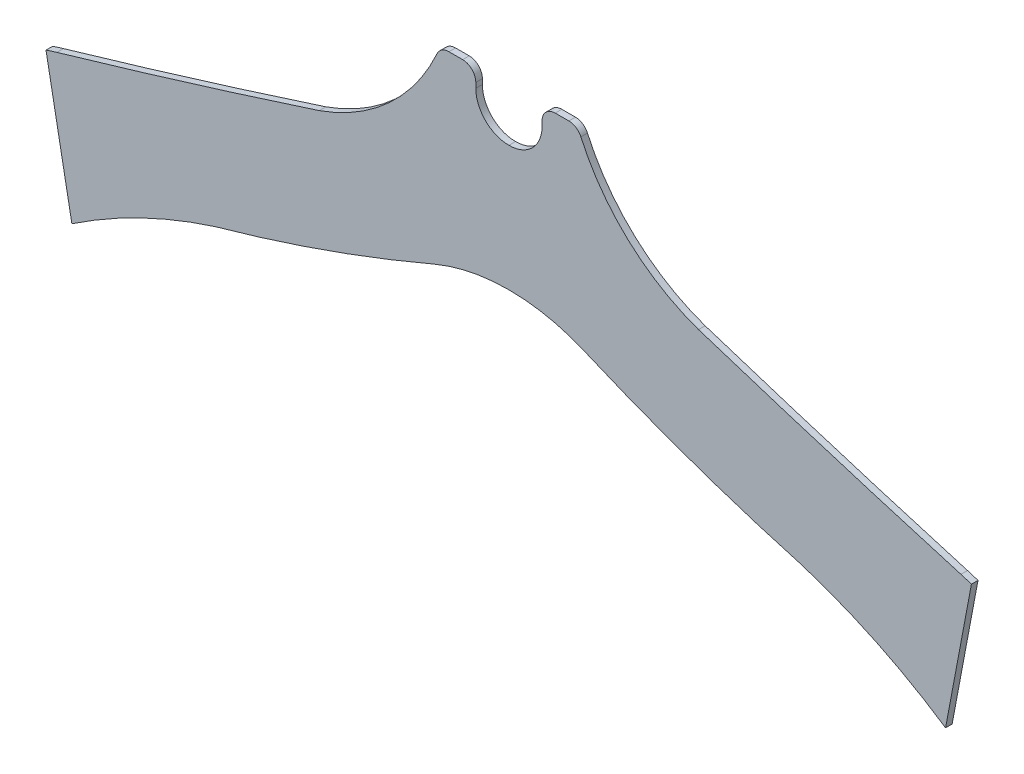
ISO-10303-21;
HEADER;
FILE_DESCRIPTION(('STEP AP214'),'2;1');
FILE_NAME('part.step','',(''),(''),'','','');
FILE_SCHEMA(('AUTOMOTIVE_DESIGN { 1 0 10303 214 1 1 1 1 }'));
ENDSEC;
DATA;
#1=APPLICATION_CONTEXT('core data for automotive mechanical design processes');
#2=APPLICATION_PROTOCOL_DEFINITION('international standard','automotive_design',2000,#1);
#3=PRODUCT_CONTEXT('',#1,'mechanical');
#4=PRODUCT('Part','Part','',(#3));
#5=PRODUCT_RELATED_PRODUCT_CATEGORY('part','',(#4));
#6=PRODUCT_DEFINITION_FORMATION('','',#4);
#7=PRODUCT_DEFINITION_CONTEXT('part definition',#1,'design');
#8=PRODUCT_DEFINITION('design','',#6,#7);
#9=PRODUCT_DEFINITION_SHAPE('','',#8);
#10=(LENGTH_UNIT() NAMED_UNIT(*) SI_UNIT(.MILLI.,.METRE.));
#11=(NAMED_UNIT(*) PLANE_ANGLE_UNIT() SI_UNIT($,.RADIAN.));
#12=(NAMED_UNIT(*) SI_UNIT($,.STERADIAN.) SOLID_ANGLE_UNIT());
#13=UNCERTAINTY_MEASURE_WITH_UNIT(LENGTH_MEASURE(1.E-05),#10,'distance_accuracy_value','');
#14=(GEOMETRIC_REPRESENTATION_CONTEXT(3) GLOBAL_UNCERTAINTY_ASSIGNED_CONTEXT((#13)) GLOBAL_UNIT_ASSIGNED_CONTEXT((#10,
#11,#12)) REPRESENTATION_CONTEXT('',''));
#15=CARTESIAN_POINT('',(0.,0.,0.));
#16=DIRECTION('',(0.,0.,1.));
#17=DIRECTION('',(1.,0.,0.));
#18=AXIS2_PLACEMENT_3D('',#15,#16,#17);
#19=CARTESIAN_POINT('',(-595.807272279208,616.910417452215,0.));
#20=DIRECTION('',(-0.982734564613668,-0.185021013708129,0.));
#21=DIRECTION('',(0.185021013708129,-0.982734564613668,0.));
#22=AXIS2_PLACEMENT_3D('',#19,#20,#21);
#23=PLANE('',#22);
#24=DIRECTION('',(0.185021013708129,-0.982734564613668,0.));
#25=VECTOR('',#24,1.);
#26=CARTESIAN_POINT('',(-168.673710483779,-1651.7989927399,6.35));
#27=LINE('',#26,#25);
#28=CARTESIAN_POINT('',(-446.607072834725,-175.562773039793,6.35));
#29=VERTEX_POINT('',#28);
#30=CARTESIAN_POINT('',(-421.626142062902,-308.248372549149,6.35));
#31=VERTEX_POINT('',#30);
#32=EDGE_CURVE('E42',#29,#31,#27,.T.);
#33=ORIENTED_EDGE('',*,*,#32,.F.);
#34=DIRECTION('',(0.,0.,-1.));
#35=VECTOR('',#34,1.);
#36=CARTESIAN_POINT('',(-446.607072834725,-175.562773039793,6.35));
#37=LINE('',#36,#35);
#38=CARTESIAN_POINT('',(-446.607072834725,-175.562773039793,0.));
#39=VERTEX_POINT('',#38);
#40=EDGE_CURVE('E242',#29,#39,#37,.T.);
#41=ORIENTED_EDGE('',*,*,#40,.T.);
#42=DIRECTION('',(0.185021013708129,-0.982734564613668,0.));
#43=VECTOR('',#42,1.);
#44=CARTESIAN_POINT('',(-168.673710483779,-1651.7989927399,0.));
#45=LINE('',#44,#43);
#46=CARTESIAN_POINT('',(-421.626142062902,-308.248372549149,0.));
#47=VERTEX_POINT('',#46);
#48=EDGE_CURVE('E238',#39,#47,#45,.T.);
#49=ORIENTED_EDGE('',*,*,#48,.T.);
#50=DIRECTION('',(0.,0.,-1.));
#51=VECTOR('',#50,1.);
#52=CARTESIAN_POINT('',(-421.626142062902,-308.248372549149,6.35));
#53=LINE('',#52,#51);
#54=EDGE_CURVE('E217',#31,#47,#53,.T.);
#55=ORIENTED_EDGE('',*,*,#54,.F.);
#56=EDGE_LOOP('',(#33,#41,#49,#55));
#57=FACE_BOUND('',#56,.T.);
#58=ADVANCED_FACE('F38',(#57),#23,.T.);
#59=CARTESIAN_POINT('',(595.807272279208,616.910417452215,0.));
#60=DIRECTION('',(0.982734564613668,-0.185021013708129,0.));
#61=DIRECTION('',(-0.185021013708129,-0.982734564613668,0.));
#62=AXIS2_PLACEMENT_3D('',#59,#60,#61);
#63=PLANE('',#62);
#64=DIRECTION('',(0.185021013708129,0.982734564613668,0.));
#65=VECTOR('',#64,1.);
#66=CARTESIAN_POINT('',(158.629030851378,-1705.15106160708,0.));
#67=LINE('',#66,#65);
#68=CARTESIAN_POINT('',(421.676967883627,-307.978412452182,0.));
#69=VERTEX_POINT('',#68);
#70=CARTESIAN_POINT('',(446.634577743631,-175.416681392487,0.));
#71=VERTEX_POINT('',#70);
#72=EDGE_CURVE('E241',#69,#71,#67,.T.);
#73=ORIENTED_EDGE('',*,*,#72,.T.);
#74=DIRECTION('',(0.,0.,-1.));
#75=VECTOR('',#74,1.);
#76=CARTESIAN_POINT('',(446.634577743631,-175.416681392487,6.35));
#77=LINE('',#76,#75);
#78=CARTESIAN_POINT('',(446.634577743631,-175.416681392487,6.35));
#79=VERTEX_POINT('',#78);
#80=EDGE_CURVE('E240',#71,#79,#77,.F.);
#81=ORIENTED_EDGE('',*,*,#80,.T.);
#82=DIRECTION('',(0.185021013708129,0.982734564613668,0.));
#83=VECTOR('',#82,1.);
#84=CARTESIAN_POINT('',(158.629030851378,-1705.15106160708,6.35));
#85=LINE('',#84,#83);
#86=CARTESIAN_POINT('',(421.676967883627,-307.978412452182,6.35));
#87=VERTEX_POINT('',#86);
#88=EDGE_CURVE('E224',#87,#79,#85,.T.);
#89=ORIENTED_EDGE('',*,*,#88,.F.);
#90=DIRECTION('',(0.,0.,-1.));
#91=VECTOR('',#90,1.);
#92=CARTESIAN_POINT('',(421.676967883627,-307.978412452182,6.35));
#93=LINE('',#92,#91);
#94=EDGE_CURVE('E244',#69,#87,#93,.F.);
#95=ORIENTED_EDGE('',*,*,#94,.F.);
#96=EDGE_LOOP('',(#73,#81,#89,#95));
#97=FACE_BOUND('',#96,.T.);
#98=ADVANCED_FACE('F415',(#97),#63,.T.);
#99=CARTESIAN_POINT('',(-118.759256121082,-759.25599804977,6.35));
#100=DIRECTION('',(0.,0.,-1.));
#101=DIRECTION('',(-1.,0.,0.));
#102=AXIS2_PLACEMENT_3D('',#99,#100,#101);
#103=CYLINDRICAL_SURFACE('',#102,543.264418915691);
#104=CARTESIAN_POINT('',(-118.759256121082,-759.25599804977,6.35));
#105=DIRECTION('',(0.,0.,1.));
#106=DIRECTION('',(1.,0.,0.));
#107=AXIS2_PLACEMENT_3D('',#104,#105,#106);
#108=CIRCLE('',#107,543.264418915691);
#109=CARTESIAN_POINT('',(-282.975927981422,-241.405523933123,6.35));
#110=VERTEX_POINT('',#109);
#111=EDGE_CURVE('E231',#110,#31,#108,.T.);
#112=ORIENTED_EDGE('',*,*,#111,.T.);
#113=ORIENTED_EDGE('',*,*,#54,.T.);
#114=CARTESIAN_POINT('',(-118.759256121082,-759.25599804977,0.));
#115=DIRECTION('',(0.,0.,1.));
#116=DIRECTION('',(1.,0.,0.));
#117=AXIS2_PLACEMENT_3D('',#114,#115,#116);
#118=CIRCLE('',#117,543.264418915691);
#119=CARTESIAN_POINT('',(-282.975927981422,-241.405523933123,0.));
#120=VERTEX_POINT('',#119);
#121=EDGE_CURVE('E211',#120,#47,#118,.T.);
#122=ORIENTED_EDGE('',*,*,#121,.F.);
#123=DIRECTION('',(0.,0.,-1.));
#124=VECTOR('',#123,1.);
#125=CARTESIAN_POINT('',(-282.975927981422,-241.405523933123,6.35));
#126=LINE('',#125,#124);
#127=EDGE_CURVE('E192',#110,#120,#126,.T.);
#128=ORIENTED_EDGE('',*,*,#127,.F.);
#129=EDGE_LOOP('',(#112,#113,#122,#128));
#130=FACE_BOUND('',#129,.T.);
#131=ADVANCED_FACE('F40',(#130),#103,.F.);
#132=CARTESIAN_POINT('',(-739.230032927644,1392.23374244673,6.35));
#133=DIRECTION('',(0.,0.,-1.));
#134=DIRECTION('',(-1.,0.,0.));
#135=AXIS2_PLACEMENT_3D('',#132,#133,#134);
#136=CYLINDRICAL_SURFACE('',#135,1696.1559659826);
#137=CARTESIAN_POINT('',(-739.230032927644,1392.23374244673,0.));
#138=DIRECTION('',(0.,0.,1.));
#139=DIRECTION('',(1.,0.,0.));
#140=AXIS2_PLACEMENT_3D('',#137,#138,#139);
#141=CIRCLE('',#140,1696.1559659826);
#142=CARTESIAN_POINT('',(-72.5526774078385,-167.409282278961,0.));
#143=VERTEX_POINT('',#142);
#144=EDGE_CURVE('E196',#120,#143,#141,.T.);
#145=ORIENTED_EDGE('',*,*,#144,.T.);
#146=DIRECTION('',(0.,0.,-1.));
#147=VECTOR('',#146,1.);
#148=CARTESIAN_POINT('',(-72.5526774078385,-167.409282278961,6.35));
#149=LINE('',#148,#147);
#150=CARTESIAN_POINT('',(-72.5526774078385,-167.409282278961,6.35));
#151=VERTEX_POINT('',#150);
#152=EDGE_CURVE('E203',#151,#143,#149,.T.);
#153=ORIENTED_EDGE('',*,*,#152,.F.);
#154=CARTESIAN_POINT('',(-739.230032927644,1392.23374244673,6.35));
#155=DIRECTION('',(0.,0.,1.));
#156=DIRECTION('',(1.,0.,0.));
#157=AXIS2_PLACEMENT_3D('',#154,#155,#156);
#158=CIRCLE('',#157,1696.1559659826);
#159=EDGE_CURVE('E198',#110,#151,#158,.T.);
#160=ORIENTED_EDGE('',*,*,#159,.F.);
#161=ORIENTED_EDGE('',*,*,#127,.T.);
#162=EDGE_LOOP('',(#145,#153,#160,#161));
#163=FACE_BOUND('',#162,.T.);
#164=ADVANCED_FACE('F194',(#163),#136,.T.);
#165=CARTESIAN_POINT('',(-0.105742081564664,-336.893600907437,6.35));
#166=DIRECTION('',(0.,0.,-1.));
#167=DIRECTION('',(-1.,0.,0.));
#168=AXIS2_PLACEMENT_3D('',#165,#166,#167);
#169=CYLINDRICAL_SURFACE('',#168,184.318997119501);
#170=CARTESIAN_POINT('',(-0.105742081564664,-336.893600907437,0.));
#171=DIRECTION('',(0.,0.,1.));
#172=DIRECTION('',(1.,0.,0.));
#173=AXIS2_PLACEMENT_3D('',#170,#171,#172);
#174=CIRCLE('',#173,184.318997119501);
#175=CARTESIAN_POINT('',(0.226609322161623,-152.574903424835,0.));
#176=VERTEX_POINT('',#175);
#177=EDGE_CURVE('E214',#176,#143,#174,.T.);
#178=ORIENTED_EDGE('',*,*,#177,.F.);
#179=DIRECTION('',(0.,0.,-1.));
#180=VECTOR('',#179,1.);
#181=CARTESIAN_POINT('',(0.226609322161623,-152.574903424835,6.35));
#182=LINE('',#181,#180);
#183=CARTESIAN_POINT('',(0.226609322161623,-152.574903424835,6.35));
#184=VERTEX_POINT('',#183);
#185=EDGE_CURVE('E303',#184,#176,#182,.T.);
#186=ORIENTED_EDGE('',*,*,#185,.F.);
#187=CARTESIAN_POINT('',(-0.105742081564664,-336.893600907437,6.35));
#188=DIRECTION('',(0.,0.,1.));
#189=DIRECTION('',(1.,0.,0.));
#190=AXIS2_PLACEMENT_3D('',#187,#188,#189);
#191=CIRCLE('',#190,184.318997119501);
#192=EDGE_CURVE('E265',#184,#151,#191,.T.);
#193=ORIENTED_EDGE('',*,*,#192,.T.);
#194=ORIENTED_EDGE('',*,*,#152,.T.);
#195=EDGE_LOOP('',(#178,#186,#193,#194));
#196=FACE_BOUND('',#195,.T.);
#197=ADVANCED_FACE('F390',(#196),#169,.F.);
#198=CARTESIAN_POINT('',(0.558960726210422,-336.893600907437,6.35));
#199=DIRECTION('',(0.,0.,-1.));
#200=DIRECTION('',(-1.,0.,0.));
#201=AXIS2_PLACEMENT_3D('',#198,#199,#200);
#202=CYLINDRICAL_SURFACE('',#201,184.318997119503);
#203=CARTESIAN_POINT('',(0.558960726210422,-336.893600907437,0.));
#204=DIRECTION('',(0.,0.,1.));
#205=DIRECTION('',(1.,0.,0.));
#206=AXIS2_PLACEMENT_3D('',#203,#204,#205);
#207=CIRCLE('',#206,184.318997119503);
#208=CARTESIAN_POINT('',(73.0058960524834,-167.409282278959,0.));
#209=VERTEX_POINT('',#208);
#210=EDGE_CURVE('E11',#209,#176,#207,.T.);
#211=ORIENTED_EDGE('',*,*,#210,.F.);
#212=DIRECTION('',(0.,0.,-1.));
#213=VECTOR('',#212,1.);
#214=CARTESIAN_POINT('',(73.0058960524834,-167.409282278959,6.35));
#215=LINE('',#214,#213);
#216=CARTESIAN_POINT('',(73.0058960524834,-167.409282278959,6.35));
#217=VERTEX_POINT('',#216);
#218=EDGE_CURVE('E57',#217,#209,#215,.T.);
#219=ORIENTED_EDGE('',*,*,#218,.F.);
#220=CARTESIAN_POINT('',(0.558960726210422,-336.893600907437,6.35));
#221=DIRECTION('',(0.,0.,1.));
#222=DIRECTION('',(1.,0.,0.));
#223=AXIS2_PLACEMENT_3D('',#220,#221,#222);
#224=CIRCLE('',#223,184.318997119503);
#225=EDGE_CURVE('E260',#217,#184,#224,.T.);
#226=ORIENTED_EDGE('',*,*,#225,.T.);
#227=ORIENTED_EDGE('',*,*,#185,.T.);
#228=EDGE_LOOP('',(#211,#219,#226,#227));
#229=FACE_BOUND('',#228,.T.);
#230=ADVANCED_FACE('F386',(#229),#202,.F.);
#231=CARTESIAN_POINT('',(739.68325157229,1392.23374244673,6.35));
#232=DIRECTION('',(0.,0.,-1.));
#233=DIRECTION('',(-1.,0.,0.));
#234=AXIS2_PLACEMENT_3D('',#231,#232,#233);
#235=CYLINDRICAL_SURFACE('',#234,1696.1559659826);
#236=CARTESIAN_POINT('',(739.68325157229,1392.23374244673,0.));
#237=DIRECTION('',(0.,0.,1.));
#238=DIRECTION('',(1.,0.,0.));
#239=AXIS2_PLACEMENT_3D('',#236,#237,#238);
#240=CIRCLE('',#239,1696.1559659826);
#241=CARTESIAN_POINT('',(283.429146629341,-241.405523934037,0.));
#242=VERTEX_POINT('',#241);
#243=EDGE_CURVE('E48',#209,#242,#240,.T.);
#244=ORIENTED_EDGE('',*,*,#243,.T.);
#245=DIRECTION('',(0.,0.,-1.));
#246=VECTOR('',#245,1.);
#247=CARTESIAN_POINT('',(283.429146629341,-241.405523934037,6.35));
#248=LINE('',#247,#246);
#249=CARTESIAN_POINT('',(283.429146629341,-241.405523934037,6.35));
#250=VERTEX_POINT('',#249);
#251=EDGE_CURVE('E204',#250,#242,#248,.T.);
#252=ORIENTED_EDGE('',*,*,#251,.F.);
#253=CARTESIAN_POINT('',(739.68325157229,1392.23374244673,6.35));
#254=DIRECTION('',(0.,0.,1.));
#255=DIRECTION('',(1.,0.,0.));
#256=AXIS2_PLACEMENT_3D('',#253,#254,#255);
#257=CIRCLE('',#256,1696.1559659826);
#258=EDGE_CURVE('E257',#217,#250,#257,.T.);
#259=ORIENTED_EDGE('',*,*,#258,.F.);
#260=ORIENTED_EDGE('',*,*,#218,.T.);
#261=EDGE_LOOP('',(#244,#252,#259,#260));
#262=FACE_BOUND('',#261,.T.);
#263=ADVANCED_FACE('F384',(#262),#235,.T.);
#264=CARTESIAN_POINT('',(119.212474765778,-759.255998049724,6.35));
#265=DIRECTION('',(0.,0.,-1.));
#266=DIRECTION('',(-1.,0.,0.));
#267=AXIS2_PLACEMENT_3D('',#264,#265,#266);
#268=CYLINDRICAL_SURFACE('',#267,543.264418915674);
#269=CARTESIAN_POINT('',(119.212474765778,-759.255998049724,0.));
#270=DIRECTION('',(0.,0.,1.));
#271=DIRECTION('',(1.,0.,0.));
#272=AXIS2_PLACEMENT_3D('',#269,#270,#271);
#273=CIRCLE('',#272,543.264418915674);
#274=EDGE_CURVE('E219',#69,#242,#273,.T.);
#275=ORIENTED_EDGE('',*,*,#274,.F.);
#276=ORIENTED_EDGE('',*,*,#94,.T.);
#277=CARTESIAN_POINT('',(119.212474765778,-759.255998049724,6.35));
#278=DIRECTION('',(0.,0.,1.));
#279=DIRECTION('',(1.,0.,0.));
#280=AXIS2_PLACEMENT_3D('',#277,#278,#279);
#281=CIRCLE('',#280,543.264418915674);
#282=EDGE_CURVE('E124',#87,#250,#281,.T.);
#283=ORIENTED_EDGE('',*,*,#282,.T.);
#284=ORIENTED_EDGE('',*,*,#251,.T.);
#285=EDGE_LOOP('',(#275,#276,#283,#284));
#286=FACE_BOUND('',#285,.T.);
#287=ADVANCED_FACE('F382',(#286),#268,.F.);
#288=CARTESIAN_POINT('',(372.646646018665,-391.712187492331,6.35));
#289=DIRECTION('',(0.,0.,-1.));
#290=DIRECTION('',(-1.,0.,0.));
#291=AXIS2_PLACEMENT_3D('',#288,#289,#290);
#292=CYLINDRICAL_SURFACE('',#291,228.599999999838);
#293=ORIENTED_EDGE('',*,*,#80,.F.);
#294=CARTESIAN_POINT('',(372.646646018665,-391.712187492331,0.));
#295=DIRECTION('',(0.,0.,1.));
#296=DIRECTION('',(1.,0.,0.));
#297=AXIS2_PLACEMENT_3D('',#294,#295,#296);
#298=CIRCLE('',#297,228.599999999838);
#299=CARTESIAN_POINT('',(436.537029391038,-172.221916836758,0.));
#300=VERTEX_POINT('',#299);
#301=EDGE_CURVE('E230',#71,#300,#298,.T.);
#302=ORIENTED_EDGE('',*,*,#301,.T.);
#303=DIRECTION('',(0.,0.,-1.));
#304=VECTOR('',#303,1.);
#305=CARTESIAN_POINT('',(436.537029391038,-172.221916836758,6.35));
#306=LINE('',#305,#304);
#307=CARTESIAN_POINT('',(436.537029391038,-172.221916836758,6.35));
#308=VERTEX_POINT('',#307);
#309=EDGE_CURVE('E350',#308,#300,#306,.T.);
#310=ORIENTED_EDGE('',*,*,#309,.F.);
#311=CARTESIAN_POINT('',(372.646646018665,-391.712187492331,6.35));
#312=DIRECTION('',(0.,0.,1.));
#313=DIRECTION('',(1.,0.,0.));
#314=AXIS2_PLACEMENT_3D('',#311,#312,#313);
#315=CIRCLE('',#314,228.599999999838);
#316=EDGE_CURVE('E237',#79,#308,#315,.T.);
#317=ORIENTED_EDGE('',*,*,#316,.F.);
#318=EDGE_LOOP('',(#293,#302,#310,#317));
#319=FACE_BOUND('',#318,.T.);
#320=ADVANCED_FACE('F413',(#319),#292,.T.);
#321=CARTESIAN_POINT('',(2850.03462450098,8119.15484968248,6.35));
#322=DIRECTION('',(0.,0.,-1.));
#323=DIRECTION('',(-1.,0.,0.));
#324=AXIS2_PLACEMENT_3D('',#321,#322,#323);
#325=CYLINDRICAL_SURFACE('',#324,8635.50226251934);
#326=CARTESIAN_POINT('',(2850.03462450098,8119.15484968248,0.));
#327=DIRECTION('',(0.,0.,1.));
#328=DIRECTION('',(1.,0.,0.));
#329=AXIS2_PLACEMENT_3D('',#326,#327,#328);
#330=CIRCLE('',#329,8635.50226251934);
#331=CARTESIAN_POINT('',(183.238526680281,-94.2547893544513,0.));
#332=VERTEX_POINT('',#331);
#333=EDGE_CURVE('E258',#332,#300,#330,.T.);
#334=ORIENTED_EDGE('',*,*,#333,.F.);
#335=DIRECTION('',(0.,0.,-1.));
#336=VECTOR('',#335,1.);
#337=CARTESIAN_POINT('',(183.238526680281,-94.2547893544513,6.35));
#338=LINE('',#337,#336);
#339=CARTESIAN_POINT('',(183.238526680281,-94.2547893544513,6.35));
#340=VERTEX_POINT('',#339);
#341=EDGE_CURVE('E348',#340,#332,#338,.T.);
#342=ORIENTED_EDGE('',*,*,#341,.F.);
#343=CARTESIAN_POINT('',(2850.03462450098,8119.15484968248,6.35));
#344=DIRECTION('',(0.,0.,1.));
#345=DIRECTION('',(1.,0.,0.));
#346=AXIS2_PLACEMENT_3D('',#343,#344,#345);
#347=CIRCLE('',#346,8635.50226251934);
#348=EDGE_CURVE('E255',#340,#308,#347,.T.);
#349=ORIENTED_EDGE('',*,*,#348,.T.);
#350=ORIENTED_EDGE('',*,*,#309,.T.);
#351=EDGE_LOOP('',(#334,#342,#349,#350));
#352=FACE_BOUND('',#351,.T.);
#353=ADVANCED_FACE('F424',(#352),#325,.F.);
#354=CARTESIAN_POINT('',(248.069088193317,90.3127412959304,6.35));
#355=DIRECTION('',(0.,0.,-1.));
#356=DIRECTION('',(-1.,0.,0.));
#357=AXIS2_PLACEMENT_3D('',#354,#355,#356);
#358=CYLINDRICAL_SURFACE('',#357,195.622532128779);
#359=CARTESIAN_POINT('',(248.069088193317,90.3127412959304,0.));
#360=DIRECTION('',(0.,0.,1.));
#361=DIRECTION('',(1.,0.,0.));
#362=AXIS2_PLACEMENT_3D('',#359,#360,#361);
#363=CIRCLE('',#362,195.622532128779);
#364=CARTESIAN_POINT('',(69.6692045827779,10.0528097969494,0.));
#365=VERTEX_POINT('',#364);
#366=EDGE_CURVE('E341',#365,#332,#363,.T.);
#367=ORIENTED_EDGE('',*,*,#366,.F.);
#368=DIRECTION('',(0.,0.,-1.));
#369=VECTOR('',#368,1.);
#370=CARTESIAN_POINT('',(69.6692045827779,10.0528097969494,6.35));
#371=LINE('',#370,#369);
#372=CARTESIAN_POINT('',(69.6692045827779,10.0528097969494,6.35));
#373=VERTEX_POINT('',#372);
#374=EDGE_CURVE('E346',#373,#365,#371,.T.);
#375=ORIENTED_EDGE('',*,*,#374,.F.);
#376=CARTESIAN_POINT('',(248.069088193317,90.3127412959304,6.35));
#377=DIRECTION('',(0.,0.,1.));
#378=DIRECTION('',(1.,0.,0.));
#379=AXIS2_PLACEMENT_3D('',#376,#377,#378);
#380=CIRCLE('',#379,195.622532128779);
#381=EDGE_CURVE('E299',#373,#340,#380,.T.);
#382=ORIENTED_EDGE('',*,*,#381,.T.);
#383=ORIENTED_EDGE('',*,*,#341,.T.);
#384=EDGE_LOOP('',(#367,#375,#382,#383));
#385=FACE_BOUND('',#384,.T.);
#386=ADVANCED_FACE('F427',(#385),#358,.F.);
#387=CARTESIAN_POINT('',(58.087315234137,4.84225905593938,6.35));
#388=DIRECTION('',(0.,0.,-1.));
#389=DIRECTION('',(-1.,0.,0.));
#390=AXIS2_PLACEMENT_3D('',#387,#388,#389);
#391=CYLINDRICAL_SURFACE('',#390,12.6999999964092);
#392=CARTESIAN_POINT('',(58.087315234137,4.84225905593938,0.));
#393=DIRECTION('',(0.,0.,1.));
#394=DIRECTION('',(1.,0.,0.));
#395=AXIS2_PLACEMENT_3D('',#392,#393,#394);
#396=CIRCLE('',#395,12.6999999964092);
#397=CARTESIAN_POINT('',(58.087315234137,17.5422590523482,0.));
#398=VERTEX_POINT('',#397);
#399=EDGE_CURVE('E262',#365,#398,#396,.T.);
#400=ORIENTED_EDGE('',*,*,#399,.T.);
#401=DIRECTION('',(0.,0.,-1.));
#402=VECTOR('',#401,1.);
#403=CARTESIAN_POINT('',(58.087315234137,17.5422590523482,6.35));
#404=LINE('',#403,#402);
#405=CARTESIAN_POINT('',(58.087315234137,17.5422590523482,6.35));
#406=VERTEX_POINT('',#405);
#407=EDGE_CURVE('E137',#406,#398,#404,.T.);
#408=ORIENTED_EDGE('',*,*,#407,.F.);
#409=CARTESIAN_POINT('',(58.087315234137,4.84225905593938,6.35));
#410=DIRECTION('',(0.,0.,1.));
#411=DIRECTION('',(1.,0.,0.));
#412=AXIS2_PLACEMENT_3D('',#409,#410,#411);
#413=CIRCLE('',#412,12.6999999964092);
#414=EDGE_CURVE('E302',#373,#406,#413,.T.);
#415=ORIENTED_EDGE('',*,*,#414,.F.);
#416=ORIENTED_EDGE('',*,*,#374,.T.);
#417=EDGE_LOOP('',(#400,#408,#415,#416));
#418=FACE_BOUND('',#417,.T.);
#419=ADVANCED_FACE('F431',(#418),#391,.T.);
#420=CARTESIAN_POINT('',(-146.711440742145,17.5422590523482,6.35));
#421=DIRECTION('',(0.,1.,0.));
#422=DIRECTION('',(0.,0.,1.));
#423=AXIS2_PLACEMENT_3D('',#420,#421,#422);
#424=PLANE('',#423);
#425=DIRECTION('',(1.,0.,0.));
#426=VECTOR('',#425,1.);
#427=CARTESIAN_POINT('',(-146.711440742145,17.5422590523482,0.));
#428=LINE('',#427,#426);
#429=CARTESIAN_POINT('',(44.9032186512337,17.5422590523482,0.));
#430=VERTEX_POINT('',#429);
#431=EDGE_CURVE('E307',#430,#398,#428,.T.);
#432=ORIENTED_EDGE('',*,*,#431,.F.);
#433=DIRECTION('',(0.,0.,-1.));
#434=VECTOR('',#433,1.);
#435=CARTESIAN_POINT('',(44.9032186512337,17.5422590523482,6.35));
#436=LINE('',#435,#434);
#437=CARTESIAN_POINT('',(44.9032186512337,17.5422590523482,6.35));
#438=VERTEX_POINT('',#437);
#439=EDGE_CURVE('E376',#438,#430,#436,.T.);
#440=ORIENTED_EDGE('',*,*,#439,.F.);
#441=DIRECTION('',(1.,0.,0.));
#442=VECTOR('',#441,1.);
#443=CARTESIAN_POINT('',(-146.711440742145,17.5422590523482,6.35));
#444=LINE('',#443,#442);
#445=EDGE_CURVE('E268',#438,#406,#444,.T.);
#446=ORIENTED_EDGE('',*,*,#445,.T.);
#447=ORIENTED_EDGE('',*,*,#407,.T.);
#448=EDGE_LOOP('',(#432,#440,#446,#447));
#449=FACE_BOUND('',#448,.T.);
#450=ADVANCED_FACE('F433',(#449),#424,.T.);
#451=CARTESIAN_POINT('',(44.9032186512333,4.84225905234936,6.35));
#452=DIRECTION('',(0.,0.,-1.));
#453=DIRECTION('',(-1.,0.,0.));
#454=AXIS2_PLACEMENT_3D('',#451,#452,#453);
#455=CYLINDRICAL_SURFACE('',#454,12.6999999999993);
#456=CARTESIAN_POINT('',(44.9032186512333,4.84225905234936,0.));
#457=DIRECTION('',(0.,0.,1.));
#458=DIRECTION('',(1.,0.,0.));
#459=AXIS2_PLACEMENT_3D('',#456,#457,#458);
#460=CIRCLE('',#459,12.6999999999993);
#461=CARTESIAN_POINT('',(32.2032186512335,4.84225905240798,0.));
#462=VERTEX_POINT('',#461);
#463=EDGE_CURVE('E310',#430,#462,#460,.T.);
#464=ORIENTED_EDGE('',*,*,#463,.T.);
#465=DIRECTION('',(0.,0.,-1.));
#466=VECTOR('',#465,1.);
#467=CARTESIAN_POINT('',(32.2032186512335,4.84225905240798,6.35));
#468=LINE('',#467,#466);
#469=CARTESIAN_POINT('',(32.2032186512335,4.84225905240798,6.35));
#470=VERTEX_POINT('',#469);
#471=EDGE_CURVE('E374',#470,#462,#468,.T.);
#472=ORIENTED_EDGE('',*,*,#471,.F.);
#473=CARTESIAN_POINT('',(44.9032186512333,4.84225905234936,6.35));
#474=DIRECTION('',(0.,0.,1.));
#475=DIRECTION('',(1.,0.,0.));
#476=AXIS2_PLACEMENT_3D('',#473,#474,#475);
#477=CIRCLE('',#476,12.6999999999993);
#478=EDGE_CURVE('E270',#438,#470,#477,.T.);
#479=ORIENTED_EDGE('',*,*,#478,.F.);
#480=ORIENTED_EDGE('',*,*,#439,.T.);
#481=EDGE_LOOP('',(#464,#472,#479,#480));
#482=FACE_BOUND('',#481,.T.);
#483=ADVANCED_FACE('F438',(#482),#455,.T.);
#484=CARTESIAN_POINT('',(32.2032186512335,-1647.66412096756,6.35));
#485=DIRECTION('',(-1.,0.,0.));
#486=DIRECTION('',(0.,0.,1.));
#487=AXIS2_PLACEMENT_3D('',#484,#485,#486);
#488=PLANE('',#487);
#489=DIRECTION('',(0.,1.,0.));
#490=VECTOR('',#489,1.);
#491=CARTESIAN_POINT('',(32.2032186512335,-1647.66412096756,0.));
#492=LINE('',#491,#490);
#493=CARTESIAN_POINT('',(32.2032186512335,0.,0.));
#494=VERTEX_POINT('',#493);
#495=EDGE_CURVE('E313',#494,#462,#492,.T.);
#496=ORIENTED_EDGE('',*,*,#495,.F.);
#497=DIRECTION('',(0.,0.,-1.));
#498=VECTOR('',#497,1.);
#499=CARTESIAN_POINT('',(32.2032186512335,0.,6.35));
#500=LINE('',#499,#498);
#501=CARTESIAN_POINT('',(32.2032186512335,0.,6.35));
#502=VERTEX_POINT('',#501);
#503=EDGE_CURVE('E372',#502,#494,#500,.T.);
#504=ORIENTED_EDGE('',*,*,#503,.F.);
#505=DIRECTION('',(0.,1.,0.));
#506=VECTOR('',#505,1.);
#507=CARTESIAN_POINT('',(32.2032186512335,-1647.66412096756,6.35));
#508=LINE('',#507,#506);
#509=EDGE_CURVE('E272',#502,#470,#508,.T.);
#510=ORIENTED_EDGE('',*,*,#509,.T.);
#511=ORIENTED_EDGE('',*,*,#471,.T.);
#512=EDGE_LOOP('',(#496,#504,#510,#511));
#513=FACE_BOUND('',#512,.T.);
#514=ADVANCED_FACE('F478',(#513),#488,.T.);
#515=CARTESIAN_POINT('',(0.453218650990461,0.,6.35));
#516=DIRECTION('',(0.,0.,-1.));
#517=DIRECTION('',(-1.,0.,0.));
#518=AXIS2_PLACEMENT_3D('',#515,#516,#517);
#519=CYLINDRICAL_SURFACE('',#518,31.7500000002437);
#520=CARTESIAN_POINT('',(0.453218650990461,0.,0.));
#521=DIRECTION('',(0.,0.,1.));
#522=DIRECTION('',(1.,0.,0.));
#523=AXIS2_PLACEMENT_3D('',#520,#521,#522);
#524=CIRCLE('',#523,31.7500000002437);
#525=CARTESIAN_POINT('',(0.226609325508758,-31.7491913003953,0.));
#526=VERTEX_POINT('',#525);
#527=EDGE_CURVE('E316',#526,#494,#524,.T.);
#528=ORIENTED_EDGE('',*,*,#527,.F.);
#529=DIRECTION('',(0.,0.,-1.));
#530=VECTOR('',#529,1.);
#531=CARTESIAN_POINT('',(0.226609325508758,-31.7491913003953,6.35));
#532=LINE('',#531,#530);
#533=CARTESIAN_POINT('',(0.226609325508758,-31.7491913003953,6.35));
#534=VERTEX_POINT('',#533);
#535=EDGE_CURVE('E370',#534,#526,#532,.T.);
#536=ORIENTED_EDGE('',*,*,#535,.F.);
#537=CARTESIAN_POINT('',(0.453218650990461,0.,6.35));
#538=DIRECTION('',(0.,0.,1.));
#539=DIRECTION('',(1.,0.,0.));
#540=AXIS2_PLACEMENT_3D('',#537,#538,#539);
#541=CIRCLE('',#540,31.7500000002437);
#542=EDGE_CURVE('E275',#534,#502,#541,.T.);
#543=ORIENTED_EDGE('',*,*,#542,.T.);
#544=ORIENTED_EDGE('',*,*,#503,.T.);
#545=EDGE_LOOP('',(#528,#536,#543,#544));
#546=FACE_BOUND('',#545,.T.);
#547=ADVANCED_FACE('F445',(#546),#519,.F.);
#548=CARTESIAN_POINT('',(0.,0.,6.35));
#549=DIRECTION('',(0.,0.,-1.));
#550=DIRECTION('',(-1.,0.,0.));
#551=AXIS2_PLACEMENT_3D('',#548,#549,#550);
#552=CYLINDRICAL_SURFACE('',#551,31.7500000002442);
#553=CARTESIAN_POINT('',(0.,0.,0.));
#554=DIRECTION('',(0.,0.,1.));
#555=DIRECTION('',(1.,0.,0.));
#556=AXIS2_PLACEMENT_3D('',#553,#554,#555);
#557=CIRCLE('',#556,31.7500000002442);
#558=CARTESIAN_POINT('',(-31.750000000244,0.,0.));
#559=VERTEX_POINT('',#558);
#560=EDGE_CURVE('E319',#559,#526,#557,.T.);
#561=ORIENTED_EDGE('',*,*,#560,.F.);
#562=DIRECTION('',(0.,0.,-1.));
#563=VECTOR('',#562,1.);
#564=CARTESIAN_POINT('',(-31.750000000244,0.,6.35));
#565=LINE('',#564,#563);
#566=CARTESIAN_POINT('',(-31.750000000244,0.,6.35));
#567=VERTEX_POINT('',#566);
#568=EDGE_CURVE('E368',#567,#559,#565,.T.);
#569=ORIENTED_EDGE('',*,*,#568,.F.);
#570=CARTESIAN_POINT('',(0.,0.,6.35));
#571=DIRECTION('',(0.,0.,1.));
#572=DIRECTION('',(1.,0.,0.));
#573=AXIS2_PLACEMENT_3D('',#570,#571,#572);
#574=CIRCLE('',#573,31.7500000002442);
#575=EDGE_CURVE('E278',#567,#534,#574,.T.);
#576=ORIENTED_EDGE('',*,*,#575,.T.);
#577=ORIENTED_EDGE('',*,*,#535,.T.);
#578=EDGE_LOOP('',(#561,#569,#576,#577));
#579=FACE_BOUND('',#578,.T.);
#580=ADVANCED_FACE('F449',(#579),#552,.F.);
#581=CARTESIAN_POINT('',(-31.7499999999418,-1647.66412096754,6.35));
#582=DIRECTION('',(-1.,-1.83422326250482E-13,0.));
#583=DIRECTION('',(1.83422326250482E-13,-1.,0.));
#584=AXIS2_PLACEMENT_3D('',#581,#582,#583);
#585=PLANE('',#584);
#586=DIRECTION('',(-1.83422326250482E-13,1.,0.));
#587=VECTOR('',#586,1.);
#588=CARTESIAN_POINT('',(-31.7499999999418,-1647.66412096754,0.));
#589=LINE('',#588,#587);
#590=CARTESIAN_POINT('',(-31.7500000002449,4.84225905240798,0.));
#591=VERTEX_POINT('',#590);
#592=EDGE_CURVE('E322',#559,#591,#589,.T.);
#593=ORIENTED_EDGE('',*,*,#592,.T.);
#594=DIRECTION('',(0.,0.,-1.));
#595=VECTOR('',#594,1.);
#596=CARTESIAN_POINT('',(-31.7500000002449,4.84225905240798,6.35));
#597=LINE('',#596,#595);
#598=CARTESIAN_POINT('',(-31.7500000002449,4.84225905240798,6.35));
#599=VERTEX_POINT('',#598);
#600=EDGE_CURVE('E365',#599,#591,#597,.T.);
#601=ORIENTED_EDGE('',*,*,#600,.F.);
#602=DIRECTION('',(-1.83422326250482E-13,1.,0.));
#603=VECTOR('',#602,1.);
#604=CARTESIAN_POINT('',(-31.7499999999418,-1647.66412096754,6.35));
#605=LINE('',#604,#603);
#606=EDGE_CURVE('E281',#567,#599,#605,.T.);
#607=ORIENTED_EDGE('',*,*,#606,.F.);
#608=ORIENTED_EDGE('',*,*,#568,.T.);
#609=EDGE_LOOP('',(#593,#601,#607,#608));
#610=FACE_BOUND('',#609,.T.);
#611=ADVANCED_FACE('F454',(#610),#585,.F.);
#612=CARTESIAN_POINT('',(-44.4500000002441,4.84225905234936,6.35));
#613=DIRECTION('',(0.,0.,-1.));
#614=DIRECTION('',(-1.,0.,0.));
#615=AXIS2_PLACEMENT_3D('',#612,#613,#614);
#616=CYLINDRICAL_SURFACE('',#615,12.699999999999);
#617=CARTESIAN_POINT('',(-44.4500000002441,4.84225905234936,0.));
#618=DIRECTION('',(0.,0.,1.));
#619=DIRECTION('',(1.,0.,0.));
#620=AXIS2_PLACEMENT_3D('',#617,#618,#619);
#621=CIRCLE('',#620,12.699999999999);
#622=CARTESIAN_POINT('',(-44.4500000002441,17.5422590523482,0.));
#623=VERTEX_POINT('',#622);
#624=EDGE_CURVE('E325',#591,#623,#621,.T.);
#625=ORIENTED_EDGE('',*,*,#624,.T.);
#626=DIRECTION('',(0.,0.,-1.));
#627=VECTOR('',#626,1.);
#628=CARTESIAN_POINT('',(-44.4500000002441,17.5422590523482,6.35));
#629=LINE('',#628,#627);
#630=CARTESIAN_POINT('',(-44.4500000002441,17.5422590523482,6.35));
#631=VERTEX_POINT('',#630);
#632=EDGE_CURVE('E362',#631,#623,#629,.T.);
#633=ORIENTED_EDGE('',*,*,#632,.F.);
#634=CARTESIAN_POINT('',(-44.4500000002441,4.84225905234936,6.35));
#635=DIRECTION('',(0.,0.,1.));
#636=DIRECTION('',(1.,0.,0.));
#637=AXIS2_PLACEMENT_3D('',#634,#635,#636);
#638=CIRCLE('',#637,12.699999999999);
#639=EDGE_CURVE('E284',#599,#631,#638,.T.);
#640=ORIENTED_EDGE('',*,*,#639,.F.);
#641=ORIENTED_EDGE('',*,*,#600,.T.);
#642=EDGE_LOOP('',(#625,#633,#640,#641));
#643=FACE_BOUND('',#642,.T.);
#644=ADVANCED_FACE('F457',(#643),#616,.T.);
#645=CARTESIAN_POINT('',(-146.711440741921,17.542259052362,6.35));
#646=DIRECTION('',(-1.34734816923583E-13,-1.,0.));
#647=DIRECTION('',(1.,-1.34734816923583E-13,0.));
#648=AXIS2_PLACEMENT_3D('',#645,#646,#647);
#649=PLANE('',#648);
#650=DIRECTION('',(-1.,1.34734816923583E-13,0.));
#651=VECTOR('',#650,1.);
#652=CARTESIAN_POINT('',(-146.711440741921,17.542259052362,0.));
#653=LINE('',#652,#651);
#654=CARTESIAN_POINT('',(-57.634096583147,17.54225905235,0.));
#655=VERTEX_POINT('',#654);
#656=EDGE_CURVE('E328',#623,#655,#653,.T.);
#657=ORIENTED_EDGE('',*,*,#656,.T.);
#658=DIRECTION('',(0.,0.,-1.));
#659=VECTOR('',#658,1.);
#660=CARTESIAN_POINT('',(-57.634096583147,17.54225905235,6.35));
#661=LINE('',#660,#659);
#662=CARTESIAN_POINT('',(-57.634096583147,17.54225905235,6.35));
#663=VERTEX_POINT('',#662);
#664=EDGE_CURVE('E359',#663,#655,#661,.T.);
#665=ORIENTED_EDGE('',*,*,#664,.F.);
#666=DIRECTION('',(-1.,1.34734816923583E-13,0.));
#667=VECTOR('',#666,1.);
#668=CARTESIAN_POINT('',(-146.711440741921,17.542259052362,6.35));
#669=LINE('',#668,#667);
#670=EDGE_CURVE('E287',#631,#663,#669,.T.);
#671=ORIENTED_EDGE('',*,*,#670,.F.);
#672=ORIENTED_EDGE('',*,*,#632,.T.);
#673=EDGE_LOOP('',(#657,#665,#671,#672));
#674=FACE_BOUND('',#673,.T.);
#675=ADVANCED_FACE('F459',(#674),#649,.F.);
#676=CARTESIAN_POINT('',(-57.6340965831479,4.84225905594116,6.35));
#677=DIRECTION('',(0.,0.,-1.));
#678=DIRECTION('',(-1.,0.,0.));
#679=AXIS2_PLACEMENT_3D('',#676,#677,#678);
#680=CYLINDRICAL_SURFACE('',#679,12.699999996408);
#681=CARTESIAN_POINT('',(-57.6340965831479,4.84225905594116,0.));
#682=DIRECTION('',(0.,0.,1.));
#683=DIRECTION('',(1.,0.,0.));
#684=AXIS2_PLACEMENT_3D('',#681,#682,#683);
#685=CIRCLE('',#684,12.699999996408);
#686=CARTESIAN_POINT('',(-69.2159859317879,10.0528097969497,0.));
#687=VERTEX_POINT('',#686);
#688=EDGE_CURVE('E331',#655,#687,#685,.T.);
#689=ORIENTED_EDGE('',*,*,#688,.T.);
#690=DIRECTION('',(0.,0.,-1.));
#691=VECTOR('',#690,1.);
#692=CARTESIAN_POINT('',(-69.2159859317879,10.0528097969497,6.35));
#693=LINE('',#692,#691);
#694=CARTESIAN_POINT('',(-69.2159859317879,10.0528097969497,6.35));
#695=VERTEX_POINT('',#694);
#696=EDGE_CURVE('E357',#695,#687,#693,.T.);
#697=ORIENTED_EDGE('',*,*,#696,.F.);
#698=CARTESIAN_POINT('',(-57.6340965831479,4.84225905594116,6.35));
#699=DIRECTION('',(0.,0.,1.));
#700=DIRECTION('',(1.,0.,0.));
#701=AXIS2_PLACEMENT_3D('',#698,#699,#700);
#702=CIRCLE('',#701,12.699999996408);
#703=EDGE_CURVE('E290',#663,#695,#702,.T.);
#704=ORIENTED_EDGE('',*,*,#703,.F.);
#705=ORIENTED_EDGE('',*,*,#664,.T.);
#706=EDGE_LOOP('',(#689,#697,#704,#705));
#707=FACE_BOUND('',#706,.T.);
#708=ADVANCED_FACE('F465',(#707),#680,.T.);
#709=CARTESIAN_POINT('',(-247.615869542328,90.3127412959321,6.35));
#710=DIRECTION('',(0.,0.,-1.));
#711=DIRECTION('',(-1.,0.,0.));
#712=AXIS2_PLACEMENT_3D('',#709,#710,#711);
#713=CYLINDRICAL_SURFACE('',#712,195.62253212878);
#714=CARTESIAN_POINT('',(-247.615869542328,90.3127412959321,0.));
#715=DIRECTION('',(0.,0.,1.));
#716=DIRECTION('',(1.,0.,0.));
#717=AXIS2_PLACEMENT_3D('',#714,#715,#716);
#718=CIRCLE('',#717,195.62253212878);
#719=CARTESIAN_POINT('',(-182.78530802929,-94.2547893544503,0.));
#720=VERTEX_POINT('',#719);
#721=EDGE_CURVE('E334',#720,#687,#718,.T.);
#722=ORIENTED_EDGE('',*,*,#721,.F.);
#723=DIRECTION('',(0.,0.,-1.));
#724=VECTOR('',#723,1.);
#725=CARTESIAN_POINT('',(-182.78530802929,-94.2547893544503,6.35));
#726=LINE('',#725,#724);
#727=CARTESIAN_POINT('',(-182.78530802929,-94.2547893544503,6.35));
#728=VERTEX_POINT('',#727);
#729=EDGE_CURVE('E355',#728,#720,#726,.T.);
#730=ORIENTED_EDGE('',*,*,#729,.F.);
#731=CARTESIAN_POINT('',(-247.615869542328,90.3127412959321,6.35));
#732=DIRECTION('',(0.,0.,1.));
#733=DIRECTION('',(1.,0.,0.));
#734=AXIS2_PLACEMENT_3D('',#731,#732,#733);
#735=CIRCLE('',#734,195.62253212878);
#736=EDGE_CURVE('E292',#728,#695,#735,.T.);
#737=ORIENTED_EDGE('',*,*,#736,.T.);
#738=ORIENTED_EDGE('',*,*,#696,.T.);
#739=EDGE_LOOP('',(#722,#730,#737,#738));
#740=FACE_BOUND('',#739,.T.);
#741=ADVANCED_FACE('F468',(#740),#713,.F.);
#742=CARTESIAN_POINT('',(-2849.58140584989,8119.15484968217,6.35));
#743=DIRECTION('',(0.,0.,-1.));
#744=DIRECTION('',(-1.,0.,0.));
#745=AXIS2_PLACEMENT_3D('',#742,#743,#744);
#746=CYLINDRICAL_SURFACE('',#745,8635.50226251915);
#747=CARTESIAN_POINT('',(-2849.58140584989,8119.15484968217,0.));
#748=DIRECTION('',(0.,0.,1.));
#749=DIRECTION('',(1.,0.,0.));
#750=AXIS2_PLACEMENT_3D('',#747,#748,#749);
#751=CIRCLE('',#750,8635.50226251915);
#752=CARTESIAN_POINT('',(-436.0838107422,-172.221916837529,0.));
#753=VERTEX_POINT('',#752);
#754=EDGE_CURVE('E229',#753,#720,#751,.T.);
#755=ORIENTED_EDGE('',*,*,#754,.F.);
#756=DIRECTION('',(0.,0.,-1.));
#757=VECTOR('',#756,1.);
#758=CARTESIAN_POINT('',(-436.0838107422,-172.221916837529,6.35));
#759=LINE('',#758,#757);
#760=CARTESIAN_POINT('',(-436.0838107422,-172.221916837529,6.35));
#761=VERTEX_POINT('',#760);
#762=EDGE_CURVE('E353',#761,#753,#759,.T.);
#763=ORIENTED_EDGE('',*,*,#762,.F.);
#764=CARTESIAN_POINT('',(-2849.58140584989,8119.15484968217,6.35));
#765=DIRECTION('',(0.,0.,1.));
#766=DIRECTION('',(1.,0.,0.));
#767=AXIS2_PLACEMENT_3D('',#764,#765,#766);
#768=CIRCLE('',#767,8635.50226251915);
#769=EDGE_CURVE('E236',#761,#728,#768,.T.);
#770=ORIENTED_EDGE('',*,*,#769,.T.);
#771=ORIENTED_EDGE('',*,*,#729,.T.);
#772=EDGE_LOOP('',(#755,#763,#770,#771));
#773=FACE_BOUND('',#772,.T.);
#774=ADVANCED_FACE('F471',(#773),#746,.F.);
#775=CARTESIAN_POINT('',(-372.193427367632,-391.712187492445,6.35));
#776=DIRECTION('',(0.,0.,-1.));
#777=DIRECTION('',(-1.,0.,0.));
#778=AXIS2_PLACEMENT_3D('',#775,#776,#777);
#779=CYLINDRICAL_SURFACE('',#778,228.599999999839);
#780=ORIENTED_EDGE('',*,*,#40,.F.);
#781=CARTESIAN_POINT('',(-372.193427367632,-391.712187492445,6.35));
#782=DIRECTION('',(0.,0.,1.));
#783=DIRECTION('',(1.,0.,0.));
#784=AXIS2_PLACEMENT_3D('',#781,#782,#783);
#785=CIRCLE('',#784,228.599999999839);
#786=EDGE_CURVE('E233',#761,#29,#785,.T.);
#787=ORIENTED_EDGE('',*,*,#786,.F.);
#788=ORIENTED_EDGE('',*,*,#762,.T.);
#789=CARTESIAN_POINT('',(-372.193427367632,-391.712187492445,0.));
#790=DIRECTION('',(0.,0.,1.));
#791=DIRECTION('',(1.,0.,0.));
#792=AXIS2_PLACEMENT_3D('',#789,#790,#791);
#793=CIRCLE('',#792,228.599999999839);
#794=EDGE_CURVE('E226',#753,#39,#793,.T.);
#795=ORIENTED_EDGE('',*,*,#794,.T.);
#796=EDGE_LOOP('',(#780,#787,#788,#795));
#797=FACE_BOUND('',#796,.T.);
#798=ADVANCED_FACE('F475',(#797),#779,.T.);
#799=CARTESIAN_POINT('',(-146.711440742145,-1647.66412096756,0.));
#800=DIRECTION('',(0.,0.,1.));
#801=DIRECTION('',(1.,0.,0.));
#802=AXIS2_PLACEMENT_3D('',#799,#800,#801);
#803=PLANE('',#802);
#804=ORIENTED_EDGE('',*,*,#48,.F.);
#805=ORIENTED_EDGE('',*,*,#794,.F.);
#806=ORIENTED_EDGE('',*,*,#754,.T.);
#807=ORIENTED_EDGE('',*,*,#721,.T.);
#808=ORIENTED_EDGE('',*,*,#688,.F.);
#809=ORIENTED_EDGE('',*,*,#656,.F.);
#810=ORIENTED_EDGE('',*,*,#624,.F.);
#811=ORIENTED_EDGE('',*,*,#592,.F.);
#812=ORIENTED_EDGE('',*,*,#560,.T.);
#813=ORIENTED_EDGE('',*,*,#527,.T.);
#814=ORIENTED_EDGE('',*,*,#495,.T.);
#815=ORIENTED_EDGE('',*,*,#463,.F.);
#816=ORIENTED_EDGE('',*,*,#431,.T.);
#817=ORIENTED_EDGE('',*,*,#399,.F.);
#818=ORIENTED_EDGE('',*,*,#366,.T.);
#819=ORIENTED_EDGE('',*,*,#333,.T.);
#820=ORIENTED_EDGE('',*,*,#301,.F.);
#821=ORIENTED_EDGE('',*,*,#72,.F.);
#822=ORIENTED_EDGE('',*,*,#274,.T.);
#823=ORIENTED_EDGE('',*,*,#243,.F.);
#824=ORIENTED_EDGE('',*,*,#210,.T.);
#825=ORIENTED_EDGE('',*,*,#177,.T.);
#826=ORIENTED_EDGE('',*,*,#144,.F.);
#827=ORIENTED_EDGE('',*,*,#121,.T.);
#828=EDGE_LOOP('',(#804,#805,#806,#807,#808,#809,#810,#811,#812,#813,#814,#815,#816,#817,#818,
#819,#820,#821,#822,#823,#824,#825,#826,#827));
#829=FACE_BOUND('',#828,.T.);
#830=ADVANCED_FACE('F209',(#829),#803,.F.);
#831=CARTESIAN_POINT('',(-146.711440742145,-1647.66412096756,6.35));
#832=DIRECTION('',(0.,0.,1.));
#833=DIRECTION('',(1.,0.,0.));
#834=AXIS2_PLACEMENT_3D('',#831,#832,#833);
#835=PLANE('',#834);
#836=ORIENTED_EDGE('',*,*,#786,.T.);
#837=ORIENTED_EDGE('',*,*,#32,.T.);
#838=ORIENTED_EDGE('',*,*,#111,.F.);
#839=ORIENTED_EDGE('',*,*,#159,.T.);
#840=ORIENTED_EDGE('',*,*,#192,.F.);
#841=ORIENTED_EDGE('',*,*,#225,.F.);
#842=ORIENTED_EDGE('',*,*,#258,.T.);
#843=ORIENTED_EDGE('',*,*,#282,.F.);
#844=ORIENTED_EDGE('',*,*,#88,.T.);
#845=ORIENTED_EDGE('',*,*,#316,.T.);
#846=ORIENTED_EDGE('',*,*,#348,.F.);
#847=ORIENTED_EDGE('',*,*,#381,.F.);
#848=ORIENTED_EDGE('',*,*,#414,.T.);
#849=ORIENTED_EDGE('',*,*,#445,.F.);
#850=ORIENTED_EDGE('',*,*,#478,.T.);
#851=ORIENTED_EDGE('',*,*,#509,.F.);
#852=ORIENTED_EDGE('',*,*,#542,.F.);
#853=ORIENTED_EDGE('',*,*,#575,.F.);
#854=ORIENTED_EDGE('',*,*,#606,.T.);
#855=ORIENTED_EDGE('',*,*,#639,.T.);
#856=ORIENTED_EDGE('',*,*,#670,.T.);
#857=ORIENTED_EDGE('',*,*,#703,.T.);
#858=ORIENTED_EDGE('',*,*,#736,.F.);
#859=ORIENTED_EDGE('',*,*,#769,.F.);
#860=EDGE_LOOP('',(#836,#837,#838,#839,#840,#841,#842,#843,#844,#845,#846,#847,#848,#849,#850,
#851,#852,#853,#854,#855,#856,#857,#858,#859));
#861=FACE_BOUND('',#860,.T.);
#862=ADVANCED_FACE('F392',(#861),#835,.T.);
#863=CLOSED_SHELL('',(#58,#98,#131,#164,#197,#230,#263,#287,#320,#353,#386,#419,#450,#483,#514,
#547,#580,#611,#644,#675,#708,#741,#774,#798,#830,#862));
#864=MANIFOLD_SOLID_BREP('B2',#863);
#865=ADVANCED_BREP_SHAPE_REPRESENTATION('',(#18,#864),#14);
#866=SHAPE_DEFINITION_REPRESENTATION(#9,#865);
ENDSEC;
END-ISO-10303-21;
